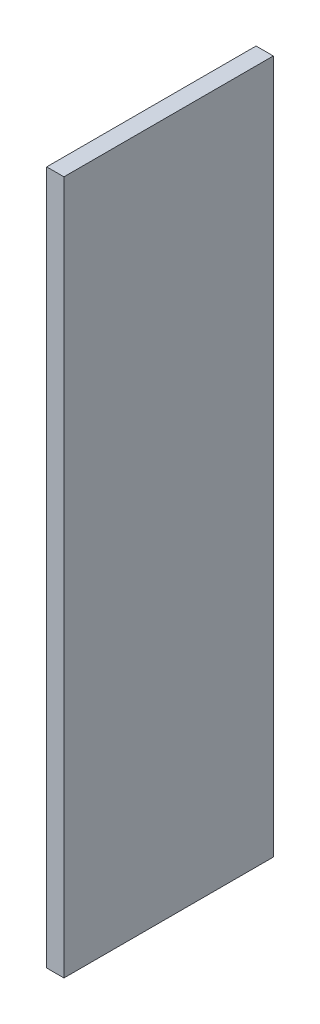
ISO-10303-21;
HEADER;
FILE_DESCRIPTION(('STEP AP214'),'2;1');
FILE_NAME('part.step','',(''),(''),'','','');
FILE_SCHEMA(('AUTOMOTIVE_DESIGN { 1 0 10303 214 1 1 1 1 }'));
ENDSEC;
DATA;
#1=APPLICATION_CONTEXT('core data for automotive mechanical design processes');
#2=APPLICATION_PROTOCOL_DEFINITION('international standard','automotive_design',2000,#1);
#3=PRODUCT_CONTEXT('',#1,'mechanical');
#4=PRODUCT('Part','Part','',(#3));
#5=PRODUCT_RELATED_PRODUCT_CATEGORY('part','',(#4));
#6=PRODUCT_DEFINITION_FORMATION('','',#4);
#7=PRODUCT_DEFINITION_CONTEXT('part definition',#1,'design');
#8=PRODUCT_DEFINITION('design','',#6,#7);
#9=PRODUCT_DEFINITION_SHAPE('','',#8);
#10=(LENGTH_UNIT() NAMED_UNIT(*) SI_UNIT(.MILLI.,.METRE.));
#11=(NAMED_UNIT(*) PLANE_ANGLE_UNIT() SI_UNIT($,.RADIAN.));
#12=(NAMED_UNIT(*) SI_UNIT($,.STERADIAN.) SOLID_ANGLE_UNIT());
#13=UNCERTAINTY_MEASURE_WITH_UNIT(LENGTH_MEASURE(1.E-05),#10,'distance_accuracy_value','');
#14=(GEOMETRIC_REPRESENTATION_CONTEXT(3) GLOBAL_UNCERTAINTY_ASSIGNED_CONTEXT((#13)) GLOBAL_UNIT_ASSIGNED_CONTEXT((#10,
#11,#12)) REPRESENTATION_CONTEXT('',''));
#15=CARTESIAN_POINT('',(0.,0.,0.));
#16=DIRECTION('',(0.,0.,1.));
#17=DIRECTION('',(1.,0.,0.));
#18=AXIS2_PLACEMENT_3D('',#15,#16,#17);
#19=CARTESIAN_POINT('',(18.288,-368.3,111.125));
#20=DIRECTION('',(0.,0.,-1.));
#21=DIRECTION('',(-1.,0.,0.));
#22=AXIS2_PLACEMENT_3D('',#19,#20,#21);
#23=PLANE('',#22);
#24=DIRECTION('',(0.,-1.,0.));
#25=VECTOR('',#24,1.);
#26=CARTESIAN_POINT('',(0.,-368.3,111.125));
#27=LINE('',#26,#25);
#28=CARTESIAN_POINT('',(0.,368.3,111.125));
#29=VERTEX_POINT('',#28);
#30=CARTESIAN_POINT('',(0.,-368.3,111.125));
#31=VERTEX_POINT('',#30);
#32=EDGE_CURVE('E97',#29,#31,#27,.T.);
#33=ORIENTED_EDGE('',*,*,#32,.T.);
#34=DIRECTION('',(-1.,0.,0.));
#35=VECTOR('',#34,1.);
#36=CARTESIAN_POINT('',(18.288,-368.3,111.125));
#37=LINE('',#36,#35);
#38=CARTESIAN_POINT('',(18.288,-368.3,111.125));
#39=VERTEX_POINT('',#38);
#40=EDGE_CURVE('E11',#39,#31,#37,.T.);
#41=ORIENTED_EDGE('',*,*,#40,.F.);
#42=DIRECTION('',(0.,-1.,0.));
#43=VECTOR('',#42,1.);
#44=CARTESIAN_POINT('',(18.288,-368.3,111.125));
#45=LINE('',#44,#43);
#46=CARTESIAN_POINT('',(18.288,368.3,111.125));
#47=VERTEX_POINT('',#46);
#48=EDGE_CURVE('E85',#47,#39,#45,.T.);
#49=ORIENTED_EDGE('',*,*,#48,.F.);
#50=DIRECTION('',(-1.,0.,0.));
#51=VECTOR('',#50,1.);
#52=CARTESIAN_POINT('',(18.288,368.3,111.125));
#53=LINE('',#52,#51);
#54=EDGE_CURVE('E93',#47,#29,#53,.T.);
#55=ORIENTED_EDGE('',*,*,#54,.T.);
#56=EDGE_LOOP('',(#33,#41,#49,#55));
#57=FACE_BOUND('',#56,.T.);
#58=ADVANCED_FACE('F34',(#57),#23,.F.);
#59=CARTESIAN_POINT('',(18.288,-368.3,-111.125));
#60=DIRECTION('',(0.,1.,0.));
#61=DIRECTION('',(0.,0.,1.));
#62=AXIS2_PLACEMENT_3D('',#59,#60,#61);
#63=PLANE('',#62);
#64=DIRECTION('',(0.,0.,-1.));
#65=VECTOR('',#64,1.);
#66=CARTESIAN_POINT('',(0.,-368.3,-111.125));
#67=LINE('',#66,#65);
#68=CARTESIAN_POINT('',(0.,-368.3,-111.125));
#69=VERTEX_POINT('',#68);
#70=EDGE_CURVE('E89',#31,#69,#67,.T.);
#71=ORIENTED_EDGE('',*,*,#70,.T.);
#72=DIRECTION('',(-1.,0.,0.));
#73=VECTOR('',#72,1.);
#74=CARTESIAN_POINT('',(18.288,-368.3,-111.125));
#75=LINE('',#74,#73);
#76=CARTESIAN_POINT('',(18.288,-368.3,-111.125));
#77=VERTEX_POINT('',#76);
#78=EDGE_CURVE('E42',#77,#69,#75,.T.);
#79=ORIENTED_EDGE('',*,*,#78,.F.);
#80=DIRECTION('',(0.,0.,-1.));
#81=VECTOR('',#80,1.);
#82=CARTESIAN_POINT('',(18.288,-368.3,-111.125));
#83=LINE('',#82,#81);
#84=EDGE_CURVE('E80',#39,#77,#83,.T.);
#85=ORIENTED_EDGE('',*,*,#84,.F.);
#86=ORIENTED_EDGE('',*,*,#40,.T.);
#87=EDGE_LOOP('',(#71,#79,#85,#86));
#88=FACE_BOUND('',#87,.T.);
#89=ADVANCED_FACE('F88',(#88),#63,.F.);
#90=CARTESIAN_POINT('',(18.288,-368.3,-111.125));
#91=DIRECTION('',(0.,0.,1.));
#92=DIRECTION('',(1.,0.,0.));
#93=AXIS2_PLACEMENT_3D('',#90,#91,#92);
#94=PLANE('',#93);
#95=DIRECTION('',(0.,1.,0.));
#96=VECTOR('',#95,1.);
#97=CARTESIAN_POINT('',(0.,-368.3,-111.125));
#98=LINE('',#97,#96);
#99=CARTESIAN_POINT('',(0.,368.3,-111.125));
#100=VERTEX_POINT('',#99);
#101=EDGE_CURVE('E67',#69,#100,#98,.T.);
#102=ORIENTED_EDGE('',*,*,#101,.T.);
#103=DIRECTION('',(-1.,0.,0.));
#104=VECTOR('',#103,1.);
#105=CARTESIAN_POINT('',(18.288,368.3,-111.125));
#106=LINE('',#105,#104);
#107=CARTESIAN_POINT('',(18.288,368.3,-111.125));
#108=VERTEX_POINT('',#107);
#109=EDGE_CURVE('E90',#108,#100,#106,.T.);
#110=ORIENTED_EDGE('',*,*,#109,.F.);
#111=DIRECTION('',(0.,1.,0.));
#112=VECTOR('',#111,1.);
#113=CARTESIAN_POINT('',(18.288,-368.3,-111.125));
#114=LINE('',#113,#112);
#115=EDGE_CURVE('E83',#77,#108,#114,.T.);
#116=ORIENTED_EDGE('',*,*,#115,.F.);
#117=ORIENTED_EDGE('',*,*,#78,.T.);
#118=EDGE_LOOP('',(#102,#110,#116,#117));
#119=FACE_BOUND('',#118,.T.);
#120=ADVANCED_FACE('F91',(#119),#94,.F.);
#121=CARTESIAN_POINT('',(18.288,368.3,-111.125));
#122=DIRECTION('',(0.,-1.,0.));
#123=DIRECTION('',(0.,0.,-1.));
#124=AXIS2_PLACEMENT_3D('',#121,#122,#123);
#125=PLANE('',#124);
#126=DIRECTION('',(0.,0.,1.));
#127=VECTOR('',#126,1.);
#128=CARTESIAN_POINT('',(0.,368.3,-111.125));
#129=LINE('',#128,#127);
#130=EDGE_CURVE('E73',#100,#29,#129,.T.);
#131=ORIENTED_EDGE('',*,*,#130,.T.);
#132=ORIENTED_EDGE('',*,*,#54,.F.);
#133=DIRECTION('',(0.,0.,1.));
#134=VECTOR('',#133,1.);
#135=CARTESIAN_POINT('',(18.288,368.3,-111.125));
#136=LINE('',#135,#134);
#137=EDGE_CURVE('E50',#108,#47,#136,.T.);
#138=ORIENTED_EDGE('',*,*,#137,.F.);
#139=ORIENTED_EDGE('',*,*,#109,.T.);
#140=EDGE_LOOP('',(#131,#132,#138,#139));
#141=FACE_BOUND('',#140,.T.);
#142=ADVANCED_FACE('F104',(#141),#125,.F.);
#143=CARTESIAN_POINT('',(18.288,0.,0.));
#144=DIRECTION('',(1.,0.,0.));
#145=DIRECTION('',(0.,0.,-1.));
#146=AXIS2_PLACEMENT_3D('',#143,#144,#145);
#147=PLANE('',#146);
#148=ORIENTED_EDGE('',*,*,#48,.T.);
#149=ORIENTED_EDGE('',*,*,#84,.T.);
#150=ORIENTED_EDGE('',*,*,#115,.T.);
#151=ORIENTED_EDGE('',*,*,#137,.T.);
#152=EDGE_LOOP('',(#148,#149,#150,#151));
#153=FACE_BOUND('',#152,.T.);
#154=ADVANCED_FACE('F81',(#153),#147,.T.);
#155=CARTESIAN_POINT('',(0.,0.,0.));
#156=DIRECTION('',(1.,0.,0.));
#157=DIRECTION('',(0.,0.,-1.));
#158=AXIS2_PLACEMENT_3D('',#155,#156,#157);
#159=PLANE('',#158);
#160=ORIENTED_EDGE('',*,*,#32,.F.);
#161=ORIENTED_EDGE('',*,*,#130,.F.);
#162=ORIENTED_EDGE('',*,*,#101,.F.);
#163=ORIENTED_EDGE('',*,*,#70,.F.);
#164=EDGE_LOOP('',(#160,#161,#162,#163));
#165=FACE_BOUND('',#164,.T.);
#166=ADVANCED_FACE('F107',(#165),#159,.F.);
#167=CLOSED_SHELL('',(#58,#89,#120,#142,#154,#166));
#168=MANIFOLD_SOLID_BREP('B2',#167);
#169=ADVANCED_BREP_SHAPE_REPRESENTATION('',(#18,#168),#14);
#170=SHAPE_DEFINITION_REPRESENTATION(#9,#169);
ENDSEC;
END-ISO-10303-21;
